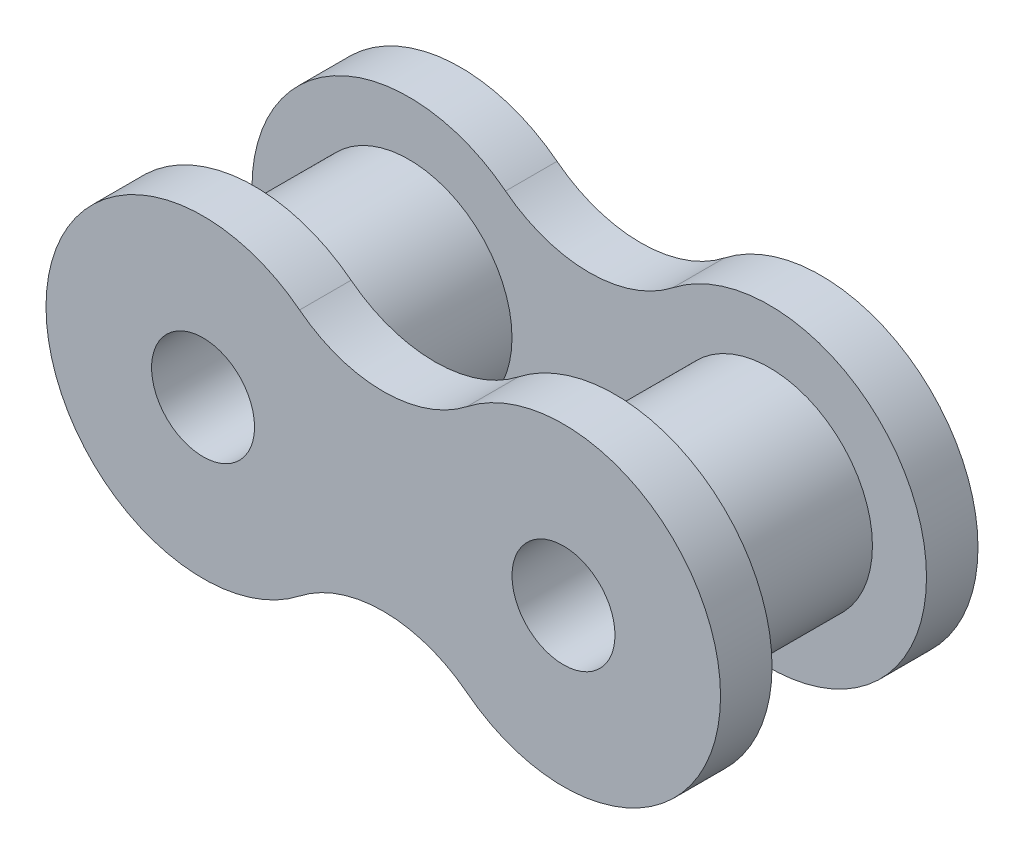
ISO-10303-21;
HEADER;
FILE_DESCRIPTION(('STEP AP214'),'2;1');
FILE_NAME('part.step','',(''),(''),'','','');
FILE_SCHEMA(('AUTOMOTIVE_DESIGN { 1 0 10303 214 1 1 1 1 }'));
ENDSEC;
DATA;
#1=APPLICATION_CONTEXT('core data for automotive mechanical design processes');
#2=APPLICATION_PROTOCOL_DEFINITION('international standard','automotive_design',2000,#1);
#3=PRODUCT_CONTEXT('',#1,'mechanical');
#4=PRODUCT('Part','Part','',(#3));
#5=PRODUCT_RELATED_PRODUCT_CATEGORY('part','',(#4));
#6=PRODUCT_DEFINITION_FORMATION('','',#4);
#7=PRODUCT_DEFINITION_CONTEXT('part definition',#1,'design');
#8=PRODUCT_DEFINITION('design','',#6,#7);
#9=PRODUCT_DEFINITION_SHAPE('','',#8);
#10=(LENGTH_UNIT() NAMED_UNIT(*) SI_UNIT(.MILLI.,.METRE.));
#11=(NAMED_UNIT(*) PLANE_ANGLE_UNIT() SI_UNIT($,.RADIAN.));
#12=(NAMED_UNIT(*) SI_UNIT($,.STERADIAN.) SOLID_ANGLE_UNIT());
#13=UNCERTAINTY_MEASURE_WITH_UNIT(LENGTH_MEASURE(1.E-05),#10,'distance_accuracy_value','');
#14=(GEOMETRIC_REPRESENTATION_CONTEXT(3) GLOBAL_UNCERTAINTY_ASSIGNED_CONTEXT((#13)) GLOBAL_UNIT_ASSIGNED_CONTEXT((#10,
#11,#12)) REPRESENTATION_CONTEXT('',''));
#15=CARTESIAN_POINT('',(0.,0.,0.));
#16=DIRECTION('',(0.,0.,1.));
#17=DIRECTION('',(1.,0.,0.));
#18=AXIS2_PLACEMENT_3D('',#15,#16,#17);
#19=CARTESIAN_POINT('',(3.5,4.4912973174237,2.));
#20=DIRECTION('',(0.,0.,1.));
#21=DIRECTION('',(1.,0.,0.));
#22=AXIS2_PLACEMENT_3D('',#19,#20,#21);
#23=PLANE('',#22);
#24=CARTESIAN_POINT('',(7.,0.,2.));
#25=DIRECTION('',(0.,0.,1.));
#26=DIRECTION('',(1.,0.,0.));
#27=AXIS2_PLACEMENT_3D('',#24,#25,#26);
#28=CIRCLE('',#27,4.);
#29=CARTESIAN_POINT('',(11.,0.,2.));
#30=VERTEX_POINT('',#29);
#31=EDGE_CURVE('E155',#30,#30,#28,.T.);
#32=ORIENTED_EDGE('',*,*,#31,.F.);
#33=EDGE_LOOP('',(#32));
#34=FACE_BOUND('',#33,.T.);
#35=CARTESIAN_POINT('',(-7.,0.,2.));
#36=DIRECTION('',(0.,0.,1.));
#37=DIRECTION('',(1.,0.,0.));
#38=AXIS2_PLACEMENT_3D('',#35,#36,#37);
#39=CIRCLE('',#38,4.);
#40=CARTESIAN_POINT('',(-3.,0.,2.));
#41=VERTEX_POINT('',#40);
#42=EDGE_CURVE('E159',#41,#41,#39,.T.);
#43=ORIENTED_EDGE('',*,*,#42,.F.);
#44=EDGE_LOOP('',(#43));
#45=FACE_BOUND('',#44,.T.);
#46=CARTESIAN_POINT('',(0.,8.98259463484739,2.));
#47=DIRECTION('',(0.,0.,-1.));
#48=DIRECTION('',(1.,0.,0.));
#49=AXIS2_PLACEMENT_3D('',#46,#47,#48);
#50=CIRCLE('',#49,5.28802030091223);
#51=CARTESIAN_POINT('',(3.25044574283209,4.81153227907224,2.));
#52=VERTEX_POINT('',#51);
#53=CARTESIAN_POINT('',(-3.25044574283209,4.81153227907223,2.));
#54=VERTEX_POINT('',#53);
#55=EDGE_CURVE('E174',#52,#54,#50,.T.);
#56=ORIENTED_EDGE('',*,*,#55,.T.);
#57=CARTESIAN_POINT('',(-7.,0.,2.));
#58=DIRECTION('',(0.,0.,1.));
#59=DIRECTION('',(1.,0.,0.));
#60=AXIS2_PLACEMENT_3D('',#57,#58,#59);
#61=CIRCLE('',#60,6.1);
#62=CARTESIAN_POINT('',(-3.2504457428321,-4.81153227907223,2.));
#63=VERTEX_POINT('',#62);
#64=EDGE_CURVE('E83',#54,#63,#61,.T.);
#65=ORIENTED_EDGE('',*,*,#64,.T.);
#66=CARTESIAN_POINT('',(0.,-8.98259463484738,2.));
#67=DIRECTION('',(0.,0.,-1.));
#68=DIRECTION('',(-1.,0.,0.));
#69=AXIS2_PLACEMENT_3D('',#66,#67,#68);
#70=CIRCLE('',#69,5.28802030091223);
#71=CARTESIAN_POINT('',(3.25044574283208,-4.81153227907222,2.));
#72=VERTEX_POINT('',#71);
#73=EDGE_CURVE('E177',#63,#72,#70,.T.);
#74=ORIENTED_EDGE('',*,*,#73,.T.);
#75=CARTESIAN_POINT('',(7.,0.,2.));
#76=DIRECTION('',(0.,0.,1.));
#77=DIRECTION('',(-1.,0.,0.));
#78=AXIS2_PLACEMENT_3D('',#75,#76,#77);
#79=CIRCLE('',#78,6.1);
#80=EDGE_CURVE('E52',#72,#52,#79,.T.);
#81=ORIENTED_EDGE('',*,*,#80,.T.);
#82=EDGE_LOOP('',(#56,#65,#74,#81));
#83=FACE_BOUND('',#82,.T.);
#84=ADVANCED_FACE('F34',(#34,#45,#83),#23,.T.);
#85=CARTESIAN_POINT('',(3.5,4.4912973174237,0.));
#86=DIRECTION('',(0.,0.,1.));
#87=DIRECTION('',(1.,0.,0.));
#88=AXIS2_PLACEMENT_3D('',#85,#86,#87);
#89=PLANE('',#88);
#90=CARTESIAN_POINT('',(0.,8.98259463484739,0.));
#91=DIRECTION('',(0.,0.,-1.));
#92=DIRECTION('',(1.,0.,0.));
#93=AXIS2_PLACEMENT_3D('',#90,#91,#92);
#94=CIRCLE('',#93,5.28802030091223);
#95=CARTESIAN_POINT('',(3.25044574283209,4.81153227907224,0.));
#96=VERTEX_POINT('',#95);
#97=CARTESIAN_POINT('',(-3.25044574283209,4.81153227907223,0.));
#98=VERTEX_POINT('',#97);
#99=EDGE_CURVE('E173',#96,#98,#94,.T.);
#100=ORIENTED_EDGE('',*,*,#99,.F.);
#101=CARTESIAN_POINT('',(7.,0.,0.));
#102=DIRECTION('',(0.,0.,1.));
#103=DIRECTION('',(-1.,0.,0.));
#104=AXIS2_PLACEMENT_3D('',#101,#102,#103);
#105=CIRCLE('',#104,6.1);
#106=CARTESIAN_POINT('',(3.25044574283208,-4.81153227907222,0.));
#107=VERTEX_POINT('',#106);
#108=EDGE_CURVE('E76',#107,#96,#105,.T.);
#109=ORIENTED_EDGE('',*,*,#108,.F.);
#110=CARTESIAN_POINT('',(0.,-8.98259463484738,0.));
#111=DIRECTION('',(0.,0.,-1.));
#112=DIRECTION('',(-1.,0.,0.));
#113=AXIS2_PLACEMENT_3D('',#110,#111,#112);
#114=CIRCLE('',#113,5.28802030091223);
#115=CARTESIAN_POINT('',(-3.2504457428321,-4.81153227907223,0.));
#116=VERTEX_POINT('',#115);
#117=EDGE_CURVE('E70',#116,#107,#114,.T.);
#118=ORIENTED_EDGE('',*,*,#117,.F.);
#119=CARTESIAN_POINT('',(-7.,0.,0.));
#120=DIRECTION('',(0.,0.,1.));
#121=DIRECTION('',(1.,0.,0.));
#122=AXIS2_PLACEMENT_3D('',#119,#120,#121);
#123=CIRCLE('',#122,6.1);
#124=EDGE_CURVE('E183',#98,#116,#123,.T.);
#125=ORIENTED_EDGE('',*,*,#124,.F.);
#126=EDGE_LOOP('',(#100,#109,#118,#125));
#127=FACE_BOUND('',#126,.T.);
#128=CARTESIAN_POINT('',(-7.,0.,0.));
#129=DIRECTION('',(0.,0.,1.));
#130=DIRECTION('',(1.,0.,0.));
#131=AXIS2_PLACEMENT_3D('',#128,#129,#130);
#132=CIRCLE('',#131,2.);
#133=CARTESIAN_POINT('',(-5.,0.,0.));
#134=VERTEX_POINT('',#133);
#135=EDGE_CURVE('E170',#134,#134,#132,.T.);
#136=ORIENTED_EDGE('',*,*,#135,.T.);
#137=EDGE_LOOP('',(#136));
#138=FACE_BOUND('',#137,.T.);
#139=CARTESIAN_POINT('',(7.,0.,0.));
#140=DIRECTION('',(0.,0.,1.));
#141=DIRECTION('',(-1.,0.,0.));
#142=AXIS2_PLACEMENT_3D('',#139,#140,#141);
#143=CIRCLE('',#142,2.);
#144=CARTESIAN_POINT('',(5.,0.,0.));
#145=VERTEX_POINT('',#144);
#146=EDGE_CURVE('E165',#145,#145,#143,.T.);
#147=ORIENTED_EDGE('',*,*,#146,.T.);
#148=EDGE_LOOP('',(#147));
#149=FACE_BOUND('',#148,.T.);
#150=ADVANCED_FACE('F194',(#127,#138,#149),#89,.F.);
#151=CARTESIAN_POINT('',(0.,8.98259463484739,2.));
#152=DIRECTION('',(0.,0.,-1.));
#153=DIRECTION('',(-1.,0.,0.));
#154=AXIS2_PLACEMENT_3D('',#151,#152,#153);
#155=CYLINDRICAL_SURFACE('',#154,5.28802030091223);
#156=ORIENTED_EDGE('',*,*,#99,.T.);
#157=DIRECTION('',(0.,0.,-1.));
#158=VECTOR('',#157,1.);
#159=CARTESIAN_POINT('',(-3.25044574283209,4.81153227907223,2.));
#160=LINE('',#159,#158);
#161=EDGE_CURVE('E11',#54,#98,#160,.T.);
#162=ORIENTED_EDGE('',*,*,#161,.F.);
#163=ORIENTED_EDGE('',*,*,#55,.F.);
#164=DIRECTION('',(0.,0.,-1.));
#165=VECTOR('',#164,1.);
#166=CARTESIAN_POINT('',(3.25044574283209,4.81153227907224,2.));
#167=LINE('',#166,#165);
#168=EDGE_CURVE('E180',#52,#96,#167,.T.);
#169=ORIENTED_EDGE('',*,*,#168,.T.);
#170=EDGE_LOOP('',(#156,#162,#163,#169));
#171=FACE_BOUND('',#170,.T.);
#172=ADVANCED_FACE('F36',(#171),#155,.F.);
#173=CARTESIAN_POINT('',(-7.,0.,2.));
#174=DIRECTION('',(0.,0.,-1.));
#175=DIRECTION('',(-1.,0.,0.));
#176=AXIS2_PLACEMENT_3D('',#173,#174,#175);
#177=CYLINDRICAL_SURFACE('',#176,6.1);
#178=ORIENTED_EDGE('',*,*,#124,.T.);
#179=DIRECTION('',(0.,0.,-1.));
#180=VECTOR('',#179,1.);
#181=CARTESIAN_POINT('',(-3.2504457428321,-4.81153227907223,2.));
#182=LINE('',#181,#180);
#183=EDGE_CURVE('E44',#63,#116,#182,.T.);
#184=ORIENTED_EDGE('',*,*,#183,.F.);
#185=ORIENTED_EDGE('',*,*,#64,.F.);
#186=ORIENTED_EDGE('',*,*,#161,.T.);
#187=EDGE_LOOP('',(#178,#184,#185,#186));
#188=FACE_BOUND('',#187,.T.);
#189=ADVANCED_FACE('F210',(#188),#177,.T.);
#190=CARTESIAN_POINT('',(0.,-8.98259463484738,2.));
#191=DIRECTION('',(0.,0.,-1.));
#192=DIRECTION('',(-1.,0.,0.));
#193=AXIS2_PLACEMENT_3D('',#190,#191,#192);
#194=CYLINDRICAL_SURFACE('',#193,5.28802030091223);
#195=ORIENTED_EDGE('',*,*,#117,.T.);
#196=DIRECTION('',(0.,0.,-1.));
#197=VECTOR('',#196,1.);
#198=CARTESIAN_POINT('',(3.25044574283208,-4.81153227907222,2.));
#199=LINE('',#198,#197);
#200=EDGE_CURVE('E188',#72,#107,#199,.T.);
#201=ORIENTED_EDGE('',*,*,#200,.F.);
#202=ORIENTED_EDGE('',*,*,#73,.F.);
#203=ORIENTED_EDGE('',*,*,#183,.T.);
#204=EDGE_LOOP('',(#195,#201,#202,#203));
#205=FACE_BOUND('',#204,.T.);
#206=ADVANCED_FACE('F191',(#205),#194,.F.);
#207=CARTESIAN_POINT('',(7.,0.,2.));
#208=DIRECTION('',(0.,0.,-1.));
#209=DIRECTION('',(-1.,0.,0.));
#210=AXIS2_PLACEMENT_3D('',#207,#208,#209);
#211=CYLINDRICAL_SURFACE('',#210,6.1);
#212=ORIENTED_EDGE('',*,*,#108,.T.);
#213=ORIENTED_EDGE('',*,*,#168,.F.);
#214=ORIENTED_EDGE('',*,*,#80,.F.);
#215=ORIENTED_EDGE('',*,*,#200,.T.);
#216=EDGE_LOOP('',(#212,#213,#214,#215));
#217=FACE_BOUND('',#216,.T.);
#218=ADVANCED_FACE('F199',(#217),#211,.T.);
#219=CARTESIAN_POINT('',(-7.,0.,2.));
#220=DIRECTION('',(0.,0.,-1.));
#221=DIRECTION('',(-1.,0.,0.));
#222=AXIS2_PLACEMENT_3D('',#219,#220,#221);
#223=CYLINDRICAL_SURFACE('',#222,2.);
#224=ORIENTED_EDGE('',*,*,#135,.F.);
#225=EDGE_LOOP('',(#224));
#226=FACE_BOUND('',#225,.T.);
#227=CARTESIAN_POINT('',(-7.,0.,10.));
#228=DIRECTION('',(0.,0.,1.));
#229=DIRECTION('',(1.,0.,0.));
#230=AXIS2_PLACEMENT_3D('',#227,#228,#229);
#231=CIRCLE('',#230,2.);
#232=CARTESIAN_POINT('',(-5.,0.,10.));
#233=VERTEX_POINT('',#232);
#234=EDGE_CURVE('E162',#233,#233,#231,.F.);
#235=ORIENTED_EDGE('',*,*,#234,.F.);
#236=EDGE_LOOP('',(#235));
#237=FACE_BOUND('',#236,.T.);
#238=ADVANCED_FACE('F201',(#226,#237),#223,.F.);
#239=CARTESIAN_POINT('',(7.,0.,2.));
#240=DIRECTION('',(0.,0.,-1.));
#241=DIRECTION('',(-1.,0.,0.));
#242=AXIS2_PLACEMENT_3D('',#239,#240,#241);
#243=CYLINDRICAL_SURFACE('',#242,2.);
#244=ORIENTED_EDGE('',*,*,#146,.F.);
#245=EDGE_LOOP('',(#244));
#246=FACE_BOUND('',#245,.T.);
#247=CARTESIAN_POINT('',(7.,0.,10.));
#248=DIRECTION('',(0.,0.,1.));
#249=DIRECTION('',(1.,0.,0.));
#250=AXIS2_PLACEMENT_3D('',#247,#248,#249);
#251=CIRCLE('',#250,2.);
#252=CARTESIAN_POINT('',(9.,0.,10.));
#253=VERTEX_POINT('',#252);
#254=EDGE_CURVE('E156',#253,#253,#251,.F.);
#255=ORIENTED_EDGE('',*,*,#254,.F.);
#256=EDGE_LOOP('',(#255));
#257=FACE_BOUND('',#256,.T.);
#258=ADVANCED_FACE('F207',(#246,#257),#243,.F.);
#259=CARTESIAN_POINT('',(-7.,0.,10.));
#260=DIRECTION('',(0.,0.,-1.));
#261=DIRECTION('',(-1.,0.,0.));
#262=AXIS2_PLACEMENT_3D('',#259,#260,#261);
#263=CYLINDRICAL_SURFACE('',#262,4.);
#264=CARTESIAN_POINT('',(-7.,0.,8.));
#265=DIRECTION('',(0.,0.,-1.));
#266=DIRECTION('',(-1.,0.,0.));
#267=AXIS2_PLACEMENT_3D('',#264,#265,#266);
#268=CIRCLE('',#267,4.);
#269=CARTESIAN_POINT('',(-11.,0.,8.));
#270=VERTEX_POINT('',#269);
#271=EDGE_CURVE('E152',#270,#270,#268,.T.);
#272=ORIENTED_EDGE('',*,*,#271,.T.);
#273=EDGE_LOOP('',(#272));
#274=FACE_BOUND('',#273,.T.);
#275=ORIENTED_EDGE('',*,*,#42,.T.);
#276=EDGE_LOOP('',(#275));
#277=FACE_BOUND('',#276,.T.);
#278=ADVANCED_FACE('F224',(#274,#277),#263,.T.);
#279=CARTESIAN_POINT('',(0.,0.,10.));
#280=DIRECTION('',(0.,0.,1.));
#281=DIRECTION('',(1.,0.,0.));
#282=AXIS2_PLACEMENT_3D('',#279,#280,#281);
#283=PLANE('',#282);
#284=ORIENTED_EDGE('',*,*,#234,.T.);
#285=EDGE_LOOP('',(#284));
#286=FACE_BOUND('',#285,.T.);
#287=ORIENTED_EDGE('',*,*,#254,.T.);
#288=EDGE_LOOP('',(#287));
#289=FACE_BOUND('',#288,.T.);
#290=CARTESIAN_POINT('',(0.,8.98259463484739,10.));
#291=DIRECTION('',(0.,0.,-1.));
#292=DIRECTION('',(1.,0.,0.));
#293=AXIS2_PLACEMENT_3D('',#290,#291,#292);
#294=CIRCLE('',#293,5.28802030091223);
#295=CARTESIAN_POINT('',(3.25044574283209,4.81153227907224,10.));
#296=VERTEX_POINT('',#295);
#297=CARTESIAN_POINT('',(-3.25044574283209,4.81153227907223,10.));
#298=VERTEX_POINT('',#297);
#299=EDGE_CURVE('E116',#296,#298,#294,.T.);
#300=ORIENTED_EDGE('',*,*,#299,.T.);
#301=CARTESIAN_POINT('',(-7.,0.,10.));
#302=DIRECTION('',(0.,0.,1.));
#303=DIRECTION('',(1.,0.,0.));
#304=AXIS2_PLACEMENT_3D('',#301,#302,#303);
#305=CIRCLE('',#304,6.1);
#306=CARTESIAN_POINT('',(-3.2504457428321,-4.81153227907223,10.));
#307=VERTEX_POINT('',#306);
#308=EDGE_CURVE('E131',#298,#307,#305,.T.);
#309=ORIENTED_EDGE('',*,*,#308,.T.);
#310=CARTESIAN_POINT('',(0.,-8.98259463484738,10.));
#311=DIRECTION('',(0.,0.,-1.));
#312=DIRECTION('',(-1.,0.,0.));
#313=AXIS2_PLACEMENT_3D('',#310,#311,#312);
#314=CIRCLE('',#313,5.28802030091223);
#315=CARTESIAN_POINT('',(3.25044574283208,-4.81153227907222,10.));
#316=VERTEX_POINT('',#315);
#317=EDGE_CURVE('E143',#307,#316,#314,.T.);
#318=ORIENTED_EDGE('',*,*,#317,.T.);
#319=CARTESIAN_POINT('',(7.,0.,10.));
#320=DIRECTION('',(0.,0.,1.));
#321=DIRECTION('',(-1.,0.,0.));
#322=AXIS2_PLACEMENT_3D('',#319,#320,#321);
#323=CIRCLE('',#322,6.1);
#324=EDGE_CURVE('E141',#316,#296,#323,.T.);
#325=ORIENTED_EDGE('',*,*,#324,.T.);
#326=EDGE_LOOP('',(#300,#309,#318,#325));
#327=FACE_BOUND('',#326,.T.);
#328=ADVANCED_FACE('F228',(#286,#289,#327),#283,.T.);
#329=CARTESIAN_POINT('',(7.,0.,10.));
#330=DIRECTION('',(0.,0.,-1.));
#331=DIRECTION('',(-1.,0.,0.));
#332=AXIS2_PLACEMENT_3D('',#329,#330,#331);
#333=CYLINDRICAL_SURFACE('',#332,4.);
#334=CARTESIAN_POINT('',(7.,0.,8.));
#335=DIRECTION('',(0.,0.,-1.));
#336=DIRECTION('',(-1.,0.,0.));
#337=AXIS2_PLACEMENT_3D('',#334,#335,#336);
#338=CIRCLE('',#337,4.);
#339=CARTESIAN_POINT('',(3.,0.,8.));
#340=VERTEX_POINT('',#339);
#341=EDGE_CURVE('E38',#340,#340,#338,.T.);
#342=ORIENTED_EDGE('',*,*,#341,.T.);
#343=EDGE_LOOP('',(#342));
#344=FACE_BOUND('',#343,.T.);
#345=ORIENTED_EDGE('',*,*,#31,.T.);
#346=EDGE_LOOP('',(#345));
#347=FACE_BOUND('',#346,.T.);
#348=ADVANCED_FACE('F232',(#344,#347),#333,.T.);
#349=CARTESIAN_POINT('',(0.,8.98259463484739,8.));
#350=DIRECTION('',(0.,0.,1.));
#351=DIRECTION('',(1.,0.,0.));
#352=AXIS2_PLACEMENT_3D('',#349,#350,#351);
#353=CYLINDRICAL_SURFACE('',#352,5.28802030091223);
#354=ORIENTED_EDGE('',*,*,#299,.F.);
#355=DIRECTION('',(0.,0.,1.));
#356=VECTOR('',#355,1.);
#357=CARTESIAN_POINT('',(3.25044574283209,4.81153227907224,8.));
#358=LINE('',#357,#356);
#359=CARTESIAN_POINT('',(3.25044574283209,4.81153227907224,8.));
#360=VERTEX_POINT('',#359);
#361=EDGE_CURVE('E110',#360,#296,#358,.T.);
#362=ORIENTED_EDGE('',*,*,#361,.F.);
#363=CARTESIAN_POINT('',(0.,8.98259463484739,8.));
#364=DIRECTION('',(0.,0.,-1.));
#365=DIRECTION('',(1.,0.,0.));
#366=AXIS2_PLACEMENT_3D('',#363,#364,#365);
#367=CIRCLE('',#366,5.28802030091223);
#368=CARTESIAN_POINT('',(-3.25044574283209,4.81153227907223,8.));
#369=VERTEX_POINT('',#368);
#370=EDGE_CURVE('E113',#360,#369,#367,.T.);
#371=ORIENTED_EDGE('',*,*,#370,.T.);
#372=DIRECTION('',(0.,0.,1.));
#373=VECTOR('',#372,1.);
#374=CARTESIAN_POINT('',(-3.25044574283209,4.81153227907223,8.));
#375=LINE('',#374,#373);
#376=EDGE_CURVE('E139',#369,#298,#375,.T.);
#377=ORIENTED_EDGE('',*,*,#376,.T.);
#378=EDGE_LOOP('',(#354,#362,#371,#377));
#379=FACE_BOUND('',#378,.T.);
#380=ADVANCED_FACE('F112',(#379),#353,.F.);
#381=CARTESIAN_POINT('',(7.,0.,8.));
#382=DIRECTION('',(0.,0.,1.));
#383=DIRECTION('',(1.,0.,0.));
#384=AXIS2_PLACEMENT_3D('',#381,#382,#383);
#385=CYLINDRICAL_SURFACE('',#384,6.1);
#386=ORIENTED_EDGE('',*,*,#324,.F.);
#387=DIRECTION('',(0.,0.,1.));
#388=VECTOR('',#387,1.);
#389=CARTESIAN_POINT('',(3.25044574283208,-4.81153227907222,8.));
#390=LINE('',#389,#388);
#391=CARTESIAN_POINT('',(3.25044574283208,-4.81153227907222,8.));
#392=VERTEX_POINT('',#391);
#393=EDGE_CURVE('E121',#392,#316,#390,.T.);
#394=ORIENTED_EDGE('',*,*,#393,.F.);
#395=CARTESIAN_POINT('',(7.,0.,8.));
#396=DIRECTION('',(0.,0.,1.));
#397=DIRECTION('',(-1.,0.,0.));
#398=AXIS2_PLACEMENT_3D('',#395,#396,#397);
#399=CIRCLE('',#398,6.1);
#400=EDGE_CURVE('E127',#392,#360,#399,.T.);
#401=ORIENTED_EDGE('',*,*,#400,.T.);
#402=ORIENTED_EDGE('',*,*,#361,.T.);
#403=EDGE_LOOP('',(#386,#394,#401,#402));
#404=FACE_BOUND('',#403,.T.);
#405=ADVANCED_FACE('F133',(#404),#385,.T.);
#406=CARTESIAN_POINT('',(0.,-8.98259463484738,8.));
#407=DIRECTION('',(0.,0.,1.));
#408=DIRECTION('',(1.,0.,0.));
#409=AXIS2_PLACEMENT_3D('',#406,#407,#408);
#410=CYLINDRICAL_SURFACE('',#409,5.28802030091223);
#411=ORIENTED_EDGE('',*,*,#317,.F.);
#412=DIRECTION('',(0.,0.,1.));
#413=VECTOR('',#412,1.);
#414=CARTESIAN_POINT('',(-3.2504457428321,-4.81153227907223,8.));
#415=LINE('',#414,#413);
#416=CARTESIAN_POINT('',(-3.2504457428321,-4.81153227907223,8.));
#417=VERTEX_POINT('',#416);
#418=EDGE_CURVE('E149',#417,#307,#415,.T.);
#419=ORIENTED_EDGE('',*,*,#418,.F.);
#420=CARTESIAN_POINT('',(0.,-8.98259463484738,8.));
#421=DIRECTION('',(0.,0.,-1.));
#422=DIRECTION('',(-1.,0.,0.));
#423=AXIS2_PLACEMENT_3D('',#420,#421,#422);
#424=CIRCLE('',#423,5.28802030091223);
#425=EDGE_CURVE('E134',#417,#392,#424,.T.);
#426=ORIENTED_EDGE('',*,*,#425,.T.);
#427=ORIENTED_EDGE('',*,*,#393,.T.);
#428=EDGE_LOOP('',(#411,#419,#426,#427));
#429=FACE_BOUND('',#428,.T.);
#430=ADVANCED_FACE('F241',(#429),#410,.F.);
#431=CARTESIAN_POINT('',(-7.,0.,8.));
#432=DIRECTION('',(0.,0.,1.));
#433=DIRECTION('',(1.,0.,0.));
#434=AXIS2_PLACEMENT_3D('',#431,#432,#433);
#435=CYLINDRICAL_SURFACE('',#434,6.1);
#436=ORIENTED_EDGE('',*,*,#308,.F.);
#437=ORIENTED_EDGE('',*,*,#376,.F.);
#438=CARTESIAN_POINT('',(-7.,0.,8.));
#439=DIRECTION('',(0.,0.,1.));
#440=DIRECTION('',(1.,0.,0.));
#441=AXIS2_PLACEMENT_3D('',#438,#439,#440);
#442=CIRCLE('',#441,6.1);
#443=EDGE_CURVE('E130',#369,#417,#442,.T.);
#444=ORIENTED_EDGE('',*,*,#443,.T.);
#445=ORIENTED_EDGE('',*,*,#418,.T.);
#446=EDGE_LOOP('',(#436,#437,#444,#445));
#447=FACE_BOUND('',#446,.T.);
#448=ADVANCED_FACE('F244',(#447),#435,.T.);
#449=CARTESIAN_POINT('',(3.5,4.4912973174237,8.));
#450=DIRECTION('',(0.,0.,-1.));
#451=DIRECTION('',(1.,0.,0.));
#452=AXIS2_PLACEMENT_3D('',#449,#450,#451);
#453=PLANE('',#452);
#454=ORIENTED_EDGE('',*,*,#271,.F.);
#455=EDGE_LOOP('',(#454));
#456=FACE_BOUND('',#455,.T.);
#457=ORIENTED_EDGE('',*,*,#341,.F.);
#458=EDGE_LOOP('',(#457));
#459=FACE_BOUND('',#458,.T.);
#460=ORIENTED_EDGE('',*,*,#370,.F.);
#461=ORIENTED_EDGE('',*,*,#400,.F.);
#462=ORIENTED_EDGE('',*,*,#425,.F.);
#463=ORIENTED_EDGE('',*,*,#443,.F.);
#464=EDGE_LOOP('',(#460,#461,#462,#463));
#465=FACE_BOUND('',#464,.T.);
#466=ADVANCED_FACE('F125',(#456,#459,#465),#453,.T.);
#467=CLOSED_SHELL('',(#84,#150,#172,#189,#206,#218,#238,#258,#278,#328,#348,#380,#405,#430,#448,#466));
#468=MANIFOLD_SOLID_BREP('B2',#467);
#469=ADVANCED_BREP_SHAPE_REPRESENTATION('',(#18,#468),#14);
#470=SHAPE_DEFINITION_REPRESENTATION(#9,#469);
ENDSEC;
END-ISO-10303-21;
